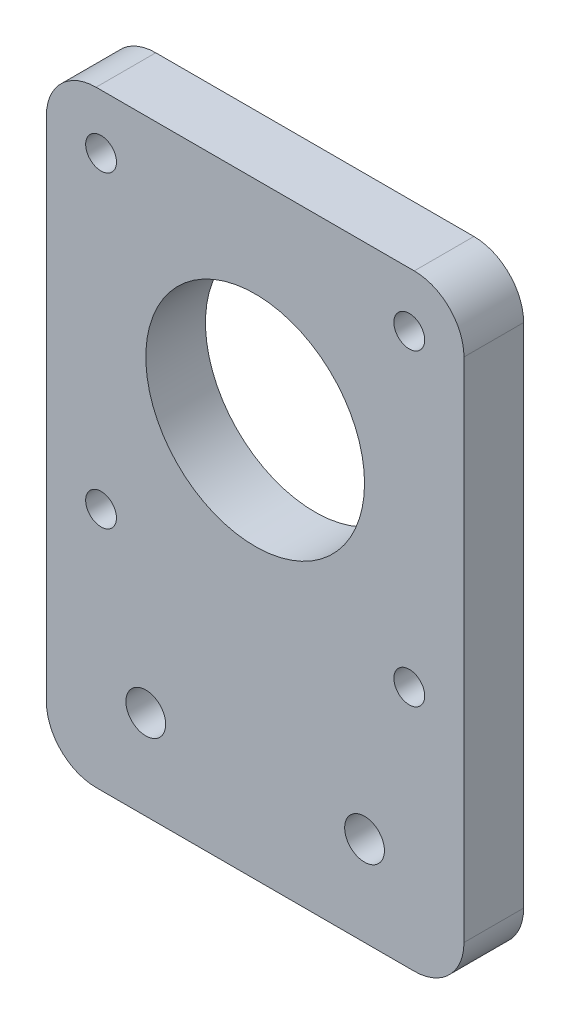
ISO-10303-21;
HEADER;
FILE_DESCRIPTION(('STEP AP214'),'2;1');
FILE_NAME('part.step','',(''),(''),'','','');
FILE_SCHEMA(('AUTOMOTIVE_DESIGN { 1 0 10303 214 1 1 1 1 }'));
ENDSEC;
DATA;
#1=APPLICATION_CONTEXT('core data for automotive mechanical design processes');
#2=APPLICATION_PROTOCOL_DEFINITION('international standard','automotive_design',2000,#1);
#3=PRODUCT_CONTEXT('',#1,'mechanical');
#4=PRODUCT('Part','Part','',(#3));
#5=PRODUCT_RELATED_PRODUCT_CATEGORY('part','',(#4));
#6=PRODUCT_DEFINITION_FORMATION('','',#4);
#7=PRODUCT_DEFINITION_CONTEXT('part definition',#1,'design');
#8=PRODUCT_DEFINITION('design','',#6,#7);
#9=PRODUCT_DEFINITION_SHAPE('','',#8);
#10=(LENGTH_UNIT() NAMED_UNIT(*) SI_UNIT(.MILLI.,.METRE.));
#11=(NAMED_UNIT(*) PLANE_ANGLE_UNIT() SI_UNIT($,.RADIAN.));
#12=(NAMED_UNIT(*) SI_UNIT($,.STERADIAN.) SOLID_ANGLE_UNIT());
#13=UNCERTAINTY_MEASURE_WITH_UNIT(LENGTH_MEASURE(1.E-05),#10,'distance_accuracy_value','');
#14=(GEOMETRIC_REPRESENTATION_CONTEXT(3) GLOBAL_UNCERTAINTY_ASSIGNED_CONTEXT((#13)) GLOBAL_UNIT_ASSIGNED_CONTEXT((#10,
#11,#12)) REPRESENTATION_CONTEXT('',''));
#15=CARTESIAN_POINT('',(0.,0.,0.));
#16=DIRECTION('',(0.,0.,1.));
#17=DIRECTION('',(1.,0.,0.));
#18=AXIS2_PLACEMENT_3D('',#15,#16,#17);
#19=CARTESIAN_POINT('',(5.,5.,6.));
#20=DIRECTION('',(0.,0.,-1.));
#21=DIRECTION('',(-1.,0.,0.));
#22=AXIS2_PLACEMENT_3D('',#19,#20,#21);
#23=PLANE('',#22);
#24=CARTESIAN_POINT('',(5.,5.,6.));
#25=DIRECTION('',(0.,0.,1.));
#26=DIRECTION('',(-1.,0.,0.));
#27=AXIS2_PLACEMENT_3D('',#24,#25,#26);
#28=CIRCLE('',#27,5.);
#29=CARTESIAN_POINT('',(0.,5.00000000000003,6.));
#30=VERTEX_POINT('',#29);
#31=CARTESIAN_POINT('',(5.00000000000003,0.,6.));
#32=VERTEX_POINT('',#31);
#33=EDGE_CURVE('E145',#30,#32,#28,.T.);
#34=ORIENTED_EDGE('',*,*,#33,.T.);
#35=DIRECTION('',(1.,0.,0.));
#36=VECTOR('',#35,1.);
#37=CARTESIAN_POINT('',(5.00000000000003,0.,6.));
#38=LINE('',#37,#36);
#39=CARTESIAN_POINT('',(37.,0.,6.));
#40=VERTEX_POINT('',#39);
#41=EDGE_CURVE('E93',#32,#40,#38,.T.);
#42=ORIENTED_EDGE('',*,*,#41,.T.);
#43=CARTESIAN_POINT('',(37.,5.,6.));
#44=DIRECTION('',(0.,0.,1.));
#45=DIRECTION('',(1.,0.,0.));
#46=AXIS2_PLACEMENT_3D('',#43,#44,#45);
#47=CIRCLE('',#46,5.);
#48=CARTESIAN_POINT('',(42.,5.,6.));
#49=VERTEX_POINT('',#48);
#50=EDGE_CURVE('E160',#40,#49,#47,.T.);
#51=ORIENTED_EDGE('',*,*,#50,.T.);
#52=DIRECTION('',(0.,1.,0.));
#53=VECTOR('',#52,1.);
#54=CARTESIAN_POINT('',(42.,5.00000000000003,6.));
#55=LINE('',#54,#53);
#56=CARTESIAN_POINT('',(42.,56.,6.));
#57=VERTEX_POINT('',#56);
#58=EDGE_CURVE('E173',#49,#57,#55,.T.);
#59=ORIENTED_EDGE('',*,*,#58,.T.);
#60=CARTESIAN_POINT('',(37.,56.,6.));
#61=DIRECTION('',(0.,0.,1.));
#62=DIRECTION('',(-1.,0.,0.));
#63=AXIS2_PLACEMENT_3D('',#60,#61,#62);
#64=CIRCLE('',#63,5.);
#65=CARTESIAN_POINT('',(37.,61.,6.));
#66=VERTEX_POINT('',#65);
#67=EDGE_CURVE('E112',#57,#66,#64,.T.);
#68=ORIENTED_EDGE('',*,*,#67,.T.);
#69=DIRECTION('',(-1.,0.,0.));
#70=VECTOR('',#69,1.);
#71=CARTESIAN_POINT('',(5.00000000000004,61.,6.));
#72=LINE('',#71,#70);
#73=CARTESIAN_POINT('',(5.00000000000004,61.,6.));
#74=VERTEX_POINT('',#73);
#75=EDGE_CURVE('E106',#66,#74,#72,.T.);
#76=ORIENTED_EDGE('',*,*,#75,.T.);
#77=CARTESIAN_POINT('',(5.,56.,6.));
#78=DIRECTION('',(0.,0.,1.));
#79=DIRECTION('',(-1.,0.,0.));
#80=AXIS2_PLACEMENT_3D('',#77,#78,#79);
#81=CIRCLE('',#80,5.);
#82=CARTESIAN_POINT('',(0.,56.,6.));
#83=VERTEX_POINT('',#82);
#84=EDGE_CURVE('E110',#74,#83,#81,.T.);
#85=ORIENTED_EDGE('',*,*,#84,.T.);
#86=DIRECTION('',(0.,-1.,0.));
#87=VECTOR('',#86,1.);
#88=CARTESIAN_POINT('',(0.,5.00000000000003,6.));
#89=LINE('',#88,#87);
#90=EDGE_CURVE('E50',#83,#30,#89,.T.);
#91=ORIENTED_EDGE('',*,*,#90,.T.);
#92=EDGE_LOOP('',(#34,#42,#51,#59,#68,#76,#85,#91));
#93=FACE_BOUND('',#92,.T.);
#94=CARTESIAN_POINT('',(21.,40.,6.));
#95=DIRECTION('',(0.,0.,1.));
#96=DIRECTION('',(1.,0.,0.));
#97=AXIS2_PLACEMENT_3D('',#94,#95,#96);
#98=CIRCLE('',#97,11.);
#99=CARTESIAN_POINT('',(32.,40.,6.));
#100=VERTEX_POINT('',#99);
#101=EDGE_CURVE('E134',#100,#100,#98,.T.);
#102=ORIENTED_EDGE('',*,*,#101,.F.);
#103=EDGE_LOOP('',(#102));
#104=FACE_BOUND('',#103,.T.);
#105=CARTESIAN_POINT('',(36.5,55.5,6.));
#106=DIRECTION('',(0.,0.,1.));
#107=DIRECTION('',(1.,0.,0.));
#108=AXIS2_PLACEMENT_3D('',#105,#106,#107);
#109=CIRCLE('',#108,1.55);
#110=CARTESIAN_POINT('',(38.05,55.5,6.));
#111=VERTEX_POINT('',#110);
#112=EDGE_CURVE('E182',#111,#111,#109,.T.);
#113=ORIENTED_EDGE('',*,*,#112,.F.);
#114=EDGE_LOOP('',(#113));
#115=FACE_BOUND('',#114,.T.);
#116=CARTESIAN_POINT('',(5.49999999999999,55.5,6.));
#117=DIRECTION('',(0.,0.,1.));
#118=DIRECTION('',(1.,0.,0.));
#119=AXIS2_PLACEMENT_3D('',#116,#117,#118);
#120=CIRCLE('',#119,1.55);
#121=CARTESIAN_POINT('',(7.05,55.5,6.));
#122=VERTEX_POINT('',#121);
#123=EDGE_CURVE('E188',#122,#122,#120,.T.);
#124=ORIENTED_EDGE('',*,*,#123,.F.);
#125=EDGE_LOOP('',(#124));
#126=FACE_BOUND('',#125,.T.);
#127=CARTESIAN_POINT('',(5.49999999999999,24.5,6.));
#128=DIRECTION('',(0.,0.,1.));
#129=DIRECTION('',(1.,0.,0.));
#130=AXIS2_PLACEMENT_3D('',#127,#128,#129);
#131=CIRCLE('',#130,1.55);
#132=CARTESIAN_POINT('',(7.04999999999999,24.5,6.));
#133=VERTEX_POINT('',#132);
#134=EDGE_CURVE('E194',#133,#133,#131,.T.);
#135=ORIENTED_EDGE('',*,*,#134,.F.);
#136=EDGE_LOOP('',(#135));
#137=FACE_BOUND('',#136,.T.);
#138=CARTESIAN_POINT('',(36.5,24.5,6.));
#139=DIRECTION('',(0.,0.,1.));
#140=DIRECTION('',(1.,0.,0.));
#141=AXIS2_PLACEMENT_3D('',#138,#139,#140);
#142=CIRCLE('',#141,1.55);
#143=CARTESIAN_POINT('',(38.05,24.5,6.));
#144=VERTEX_POINT('',#143);
#145=EDGE_CURVE('E200',#144,#144,#142,.T.);
#146=ORIENTED_EDGE('',*,*,#145,.F.);
#147=EDGE_LOOP('',(#146));
#148=FACE_BOUND('',#147,.T.);
#149=CARTESIAN_POINT('',(10.,9.,6.));
#150=DIRECTION('',(0.,0.,1.));
#151=DIRECTION('',(1.,0.,0.));
#152=AXIS2_PLACEMENT_3D('',#149,#150,#151);
#153=CIRCLE('',#152,2.);
#154=CARTESIAN_POINT('',(12.,9.,6.));
#155=VERTEX_POINT('',#154);
#156=EDGE_CURVE('E206',#155,#155,#153,.T.);
#157=ORIENTED_EDGE('',*,*,#156,.F.);
#158=EDGE_LOOP('',(#157));
#159=FACE_BOUND('',#158,.T.);
#160=CARTESIAN_POINT('',(32.,9.,6.));
#161=DIRECTION('',(0.,0.,1.));
#162=DIRECTION('',(1.,0.,0.));
#163=AXIS2_PLACEMENT_3D('',#160,#161,#162);
#164=CIRCLE('',#163,2.);
#165=CARTESIAN_POINT('',(34.,9.,6.));
#166=VERTEX_POINT('',#165);
#167=EDGE_CURVE('E212',#166,#166,#164,.T.);
#168=ORIENTED_EDGE('',*,*,#167,.F.);
#169=EDGE_LOOP('',(#168));
#170=FACE_BOUND('',#169,.T.);
#171=ADVANCED_FACE('F33',(#93,#104,#115,#126,#137,#148,#159,#170),#23,.F.);
#172=CARTESIAN_POINT('',(5.,5.,0.));
#173=DIRECTION('',(0.,0.,-1.));
#174=DIRECTION('',(-1.,0.,0.));
#175=AXIS2_PLACEMENT_3D('',#172,#173,#174);
#176=PLANE('',#175);
#177=CARTESIAN_POINT('',(10.,9.,0.));
#178=DIRECTION('',(0.,0.,1.));
#179=DIRECTION('',(1.,0.,0.));
#180=AXIS2_PLACEMENT_3D('',#177,#178,#179);
#181=CIRCLE('',#180,2.);
#182=CARTESIAN_POINT('',(12.,9.,0.));
#183=VERTEX_POINT('',#182);
#184=EDGE_CURVE('E209',#183,#183,#181,.T.);
#185=ORIENTED_EDGE('',*,*,#184,.T.);
#186=EDGE_LOOP('',(#185));
#187=FACE_BOUND('',#186,.T.);
#188=CARTESIAN_POINT('',(5.49999999999999,24.5,0.));
#189=DIRECTION('',(0.,0.,1.));
#190=DIRECTION('',(1.,0.,0.));
#191=AXIS2_PLACEMENT_3D('',#188,#189,#190);
#192=CIRCLE('',#191,1.55);
#193=CARTESIAN_POINT('',(7.04999999999999,24.5,0.));
#194=VERTEX_POINT('',#193);
#195=EDGE_CURVE('E197',#194,#194,#192,.T.);
#196=ORIENTED_EDGE('',*,*,#195,.T.);
#197=EDGE_LOOP('',(#196));
#198=FACE_BOUND('',#197,.T.);
#199=CARTESIAN_POINT('',(36.5,55.5,0.));
#200=DIRECTION('',(0.,0.,1.));
#201=DIRECTION('',(1.,0.,0.));
#202=AXIS2_PLACEMENT_3D('',#199,#200,#201);
#203=CIRCLE('',#202,1.55);
#204=CARTESIAN_POINT('',(38.05,55.5,0.));
#205=VERTEX_POINT('',#204);
#206=EDGE_CURVE('E185',#205,#205,#203,.T.);
#207=ORIENTED_EDGE('',*,*,#206,.T.);
#208=EDGE_LOOP('',(#207));
#209=FACE_BOUND('',#208,.T.);
#210=CARTESIAN_POINT('',(5.,5.,0.));
#211=DIRECTION('',(0.,0.,1.));
#212=DIRECTION('',(-1.,0.,0.));
#213=AXIS2_PLACEMENT_3D('',#210,#211,#212);
#214=CIRCLE('',#213,5.);
#215=CARTESIAN_POINT('',(0.,5.00000000000003,0.));
#216=VERTEX_POINT('',#215);
#217=CARTESIAN_POINT('',(5.00000000000003,0.,0.));
#218=VERTEX_POINT('',#217);
#219=EDGE_CURVE('E130',#216,#218,#214,.T.);
#220=ORIENTED_EDGE('',*,*,#219,.F.);
#221=DIRECTION('',(0.,-1.,0.));
#222=VECTOR('',#221,1.);
#223=CARTESIAN_POINT('',(0.,5.00000000000003,0.));
#224=LINE('',#223,#222);
#225=CARTESIAN_POINT('',(0.,56.,0.));
#226=VERTEX_POINT('',#225);
#227=EDGE_CURVE('E85',#226,#216,#224,.T.);
#228=ORIENTED_EDGE('',*,*,#227,.F.);
#229=CARTESIAN_POINT('',(5.,56.,0.));
#230=DIRECTION('',(0.,0.,1.));
#231=DIRECTION('',(-1.,0.,0.));
#232=AXIS2_PLACEMENT_3D('',#229,#230,#231);
#233=CIRCLE('',#232,5.);
#234=CARTESIAN_POINT('',(5.00000000000004,61.,0.));
#235=VERTEX_POINT('',#234);
#236=EDGE_CURVE('E79',#235,#226,#233,.T.);
#237=ORIENTED_EDGE('',*,*,#236,.F.);
#238=DIRECTION('',(-1.,0.,0.));
#239=VECTOR('',#238,1.);
#240=CARTESIAN_POINT('',(5.00000000000004,61.,0.));
#241=LINE('',#240,#239);
#242=CARTESIAN_POINT('',(37.,61.,0.));
#243=VERTEX_POINT('',#242);
#244=EDGE_CURVE('E120',#243,#235,#241,.T.);
#245=ORIENTED_EDGE('',*,*,#244,.F.);
#246=CARTESIAN_POINT('',(37.,56.,0.));
#247=DIRECTION('',(0.,0.,1.));
#248=DIRECTION('',(-1.,0.,0.));
#249=AXIS2_PLACEMENT_3D('',#246,#247,#248);
#250=CIRCLE('',#249,5.);
#251=CARTESIAN_POINT('',(42.,56.,0.));
#252=VERTEX_POINT('',#251);
#253=EDGE_CURVE('E140',#252,#243,#250,.T.);
#254=ORIENTED_EDGE('',*,*,#253,.F.);
#255=DIRECTION('',(0.,1.,0.));
#256=VECTOR('',#255,1.);
#257=CARTESIAN_POINT('',(42.,5.00000000000003,0.));
#258=LINE('',#257,#256);
#259=CARTESIAN_POINT('',(42.,5.,0.));
#260=VERTEX_POINT('',#259);
#261=EDGE_CURVE('E138',#260,#252,#258,.T.);
#262=ORIENTED_EDGE('',*,*,#261,.F.);
#263=CARTESIAN_POINT('',(37.,5.,0.));
#264=DIRECTION('',(0.,0.,1.));
#265=DIRECTION('',(1.,0.,0.));
#266=AXIS2_PLACEMENT_3D('',#263,#264,#265);
#267=CIRCLE('',#266,5.);
#268=CARTESIAN_POINT('',(37.,0.,0.));
#269=VERTEX_POINT('',#268);
#270=EDGE_CURVE('E136',#269,#260,#267,.T.);
#271=ORIENTED_EDGE('',*,*,#270,.F.);
#272=DIRECTION('',(1.,0.,0.));
#273=VECTOR('',#272,1.);
#274=CARTESIAN_POINT('',(5.00000000000003,0.,0.));
#275=LINE('',#274,#273);
#276=EDGE_CURVE('E133',#218,#269,#275,.T.);
#277=ORIENTED_EDGE('',*,*,#276,.F.);
#278=EDGE_LOOP('',(#220,#228,#237,#245,#254,#262,#271,#277));
#279=FACE_BOUND('',#278,.T.);
#280=CARTESIAN_POINT('',(21.,40.,0.));
#281=DIRECTION('',(0.,0.,1.));
#282=DIRECTION('',(1.,0.,0.));
#283=AXIS2_PLACEMENT_3D('',#280,#281,#282);
#284=CIRCLE('',#283,11.);
#285=CARTESIAN_POINT('',(32.,40.,0.));
#286=VERTEX_POINT('',#285);
#287=EDGE_CURVE('E179',#286,#286,#284,.T.);
#288=ORIENTED_EDGE('',*,*,#287,.T.);
#289=EDGE_LOOP('',(#288));
#290=FACE_BOUND('',#289,.T.);
#291=CARTESIAN_POINT('',(5.49999999999999,55.5,0.));
#292=DIRECTION('',(0.,0.,1.));
#293=DIRECTION('',(1.,0.,0.));
#294=AXIS2_PLACEMENT_3D('',#291,#292,#293);
#295=CIRCLE('',#294,1.55);
#296=CARTESIAN_POINT('',(7.05,55.5,0.));
#297=VERTEX_POINT('',#296);
#298=EDGE_CURVE('E191',#297,#297,#295,.T.);
#299=ORIENTED_EDGE('',*,*,#298,.T.);
#300=EDGE_LOOP('',(#299));
#301=FACE_BOUND('',#300,.T.);
#302=CARTESIAN_POINT('',(36.5,24.5,0.));
#303=DIRECTION('',(0.,0.,1.));
#304=DIRECTION('',(1.,0.,0.));
#305=AXIS2_PLACEMENT_3D('',#302,#303,#304);
#306=CIRCLE('',#305,1.55);
#307=CARTESIAN_POINT('',(38.05,24.5,0.));
#308=VERTEX_POINT('',#307);
#309=EDGE_CURVE('E203',#308,#308,#306,.T.);
#310=ORIENTED_EDGE('',*,*,#309,.T.);
#311=EDGE_LOOP('',(#310));
#312=FACE_BOUND('',#311,.T.);
#313=CARTESIAN_POINT('',(32.,9.,0.));
#314=DIRECTION('',(0.,0.,1.));
#315=DIRECTION('',(1.,0.,0.));
#316=AXIS2_PLACEMENT_3D('',#313,#314,#315);
#317=CIRCLE('',#316,2.);
#318=CARTESIAN_POINT('',(34.,9.,0.));
#319=VERTEX_POINT('',#318);
#320=EDGE_CURVE('E215',#319,#319,#317,.T.);
#321=ORIENTED_EDGE('',*,*,#320,.T.);
#322=EDGE_LOOP('',(#321));
#323=FACE_BOUND('',#322,.T.);
#324=ADVANCED_FACE('F164',(#187,#198,#209,#279,#290,#301,#312,#323),#176,.T.);
#325=CARTESIAN_POINT('',(5.,5.,6.));
#326=DIRECTION('',(0.,0.,-1.));
#327=DIRECTION('',(-1.,0.,0.));
#328=AXIS2_PLACEMENT_3D('',#325,#326,#327);
#329=CYLINDRICAL_SURFACE('',#328,5.);
#330=ORIENTED_EDGE('',*,*,#219,.T.);
#331=DIRECTION('',(0.,0.,-1.));
#332=VECTOR('',#331,1.);
#333=CARTESIAN_POINT('',(5.00000000000003,0.,6.));
#334=LINE('',#333,#332);
#335=EDGE_CURVE('E11',#32,#218,#334,.T.);
#336=ORIENTED_EDGE('',*,*,#335,.F.);
#337=ORIENTED_EDGE('',*,*,#33,.F.);
#338=DIRECTION('',(0.,0.,-1.));
#339=VECTOR('',#338,1.);
#340=CARTESIAN_POINT('',(0.,5.00000000000003,6.));
#341=LINE('',#340,#339);
#342=EDGE_CURVE('E126',#30,#216,#341,.T.);
#343=ORIENTED_EDGE('',*,*,#342,.T.);
#344=EDGE_LOOP('',(#330,#336,#337,#343));
#345=FACE_BOUND('',#344,.T.);
#346=ADVANCED_FACE('F35',(#345),#329,.T.);
#347=CARTESIAN_POINT('',(5.00000000000003,0.,6.));
#348=DIRECTION('',(0.,1.,0.));
#349=DIRECTION('',(0.,0.,1.));
#350=AXIS2_PLACEMENT_3D('',#347,#348,#349);
#351=PLANE('',#350);
#352=ORIENTED_EDGE('',*,*,#276,.T.);
#353=DIRECTION('',(0.,0.,-1.));
#354=VECTOR('',#353,1.);
#355=CARTESIAN_POINT('',(37.,0.,6.));
#356=LINE('',#355,#354);
#357=EDGE_CURVE('E42',#40,#269,#356,.T.);
#358=ORIENTED_EDGE('',*,*,#357,.F.);
#359=ORIENTED_EDGE('',*,*,#41,.F.);
#360=ORIENTED_EDGE('',*,*,#335,.T.);
#361=EDGE_LOOP('',(#352,#358,#359,#360));
#362=FACE_BOUND('',#361,.T.);
#363=ADVANCED_FACE('F247',(#362),#351,.F.);
#364=CARTESIAN_POINT('',(37.,5.,6.));
#365=DIRECTION('',(0.,0.,-1.));
#366=DIRECTION('',(-1.,0.,0.));
#367=AXIS2_PLACEMENT_3D('',#364,#365,#366);
#368=CYLINDRICAL_SURFACE('',#367,5.);
#369=ORIENTED_EDGE('',*,*,#270,.T.);
#370=DIRECTION('',(0.,0.,-1.));
#371=VECTOR('',#370,1.);
#372=CARTESIAN_POINT('',(42.,5.,6.));
#373=LINE('',#372,#371);
#374=EDGE_CURVE('E152',#49,#260,#373,.T.);
#375=ORIENTED_EDGE('',*,*,#374,.F.);
#376=ORIENTED_EDGE('',*,*,#50,.F.);
#377=ORIENTED_EDGE('',*,*,#357,.T.);
#378=EDGE_LOOP('',(#369,#375,#376,#377));
#379=FACE_BOUND('',#378,.T.);
#380=ADVANCED_FACE('F158',(#379),#368,.T.);
#381=CARTESIAN_POINT('',(42.,5.00000000000003,6.));
#382=DIRECTION('',(-1.,0.,0.));
#383=DIRECTION('',(0.,0.,1.));
#384=AXIS2_PLACEMENT_3D('',#381,#382,#383);
#385=PLANE('',#384);
#386=ORIENTED_EDGE('',*,*,#261,.T.);
#387=DIRECTION('',(0.,0.,-1.));
#388=VECTOR('',#387,1.);
#389=CARTESIAN_POINT('',(42.,56.,6.));
#390=LINE('',#389,#388);
#391=EDGE_CURVE('E149',#57,#252,#390,.T.);
#392=ORIENTED_EDGE('',*,*,#391,.F.);
#393=ORIENTED_EDGE('',*,*,#58,.F.);
#394=ORIENTED_EDGE('',*,*,#374,.T.);
#395=EDGE_LOOP('',(#386,#392,#393,#394));
#396=FACE_BOUND('',#395,.T.);
#397=ADVANCED_FACE('F169',(#396),#385,.F.);
#398=CARTESIAN_POINT('',(37.,56.,6.));
#399=DIRECTION('',(0.,0.,-1.));
#400=DIRECTION('',(-1.,0.,0.));
#401=AXIS2_PLACEMENT_3D('',#398,#399,#400);
#402=CYLINDRICAL_SURFACE('',#401,5.);
#403=ORIENTED_EDGE('',*,*,#253,.T.);
#404=DIRECTION('',(0.,0.,-1.));
#405=VECTOR('',#404,1.);
#406=CARTESIAN_POINT('',(37.,61.,6.));
#407=LINE('',#406,#405);
#408=EDGE_CURVE('E121',#66,#243,#407,.T.);
#409=ORIENTED_EDGE('',*,*,#408,.F.);
#410=ORIENTED_EDGE('',*,*,#67,.F.);
#411=ORIENTED_EDGE('',*,*,#391,.T.);
#412=EDGE_LOOP('',(#403,#409,#410,#411));
#413=FACE_BOUND('',#412,.T.);
#414=ADVANCED_FACE('F172',(#413),#402,.T.);
#415=CARTESIAN_POINT('',(5.00000000000004,61.,6.));
#416=DIRECTION('',(0.,-1.,0.));
#417=DIRECTION('',(0.,0.,-1.));
#418=AXIS2_PLACEMENT_3D('',#415,#416,#417);
#419=PLANE('',#418);
#420=ORIENTED_EDGE('',*,*,#244,.T.);
#421=DIRECTION('',(0.,0.,-1.));
#422=VECTOR('',#421,1.);
#423=CARTESIAN_POINT('',(5.00000000000004,61.,6.));
#424=LINE('',#423,#422);
#425=EDGE_CURVE('E117',#74,#235,#424,.T.);
#426=ORIENTED_EDGE('',*,*,#425,.F.);
#427=ORIENTED_EDGE('',*,*,#75,.F.);
#428=ORIENTED_EDGE('',*,*,#408,.T.);
#429=EDGE_LOOP('',(#420,#426,#427,#428));
#430=FACE_BOUND('',#429,.T.);
#431=ADVANCED_FACE('F118',(#430),#419,.F.);
#432=CARTESIAN_POINT('',(5.,56.,6.));
#433=DIRECTION('',(0.,0.,-1.));
#434=DIRECTION('',(-1.,0.,0.));
#435=AXIS2_PLACEMENT_3D('',#432,#433,#434);
#436=CYLINDRICAL_SURFACE('',#435,5.);
#437=ORIENTED_EDGE('',*,*,#236,.T.);
#438=DIRECTION('',(0.,0.,-1.));
#439=VECTOR('',#438,1.);
#440=CARTESIAN_POINT('',(0.,56.,6.));
#441=LINE('',#440,#439);
#442=EDGE_CURVE('E122',#83,#226,#441,.T.);
#443=ORIENTED_EDGE('',*,*,#442,.F.);
#444=ORIENTED_EDGE('',*,*,#84,.F.);
#445=ORIENTED_EDGE('',*,*,#425,.T.);
#446=EDGE_LOOP('',(#437,#443,#444,#445));
#447=FACE_BOUND('',#446,.T.);
#448=ADVANCED_FACE('F124',(#447),#436,.T.);
#449=CARTESIAN_POINT('',(0.,5.00000000000003,6.));
#450=DIRECTION('',(1.,0.,0.));
#451=DIRECTION('',(0.,0.,-1.));
#452=AXIS2_PLACEMENT_3D('',#449,#450,#451);
#453=PLANE('',#452);
#454=ORIENTED_EDGE('',*,*,#227,.T.);
#455=ORIENTED_EDGE('',*,*,#342,.F.);
#456=ORIENTED_EDGE('',*,*,#90,.F.);
#457=ORIENTED_EDGE('',*,*,#442,.T.);
#458=EDGE_LOOP('',(#454,#455,#456,#457));
#459=FACE_BOUND('',#458,.T.);
#460=ADVANCED_FACE('F235',(#459),#453,.F.);
#461=CARTESIAN_POINT('',(21.,40.,6.));
#462=DIRECTION('',(0.,0.,-1.));
#463=DIRECTION('',(-1.,0.,0.));
#464=AXIS2_PLACEMENT_3D('',#461,#462,#463);
#465=CYLINDRICAL_SURFACE('',#464,11.);
#466=ORIENTED_EDGE('',*,*,#101,.T.);
#467=EDGE_LOOP('',(#466));
#468=FACE_BOUND('',#467,.T.);
#469=ORIENTED_EDGE('',*,*,#287,.F.);
#470=EDGE_LOOP('',(#469));
#471=FACE_BOUND('',#470,.T.);
#472=ADVANCED_FACE('F232',(#468,#471),#465,.F.);
#473=CARTESIAN_POINT('',(36.5,55.5,6.));
#474=DIRECTION('',(0.,0.,-1.));
#475=DIRECTION('',(-1.,0.,0.));
#476=AXIS2_PLACEMENT_3D('',#473,#474,#475);
#477=CYLINDRICAL_SURFACE('',#476,1.55);
#478=ORIENTED_EDGE('',*,*,#112,.T.);
#479=EDGE_LOOP('',(#478));
#480=FACE_BOUND('',#479,.T.);
#481=ORIENTED_EDGE('',*,*,#206,.F.);
#482=EDGE_LOOP('',(#481));
#483=FACE_BOUND('',#482,.T.);
#484=ADVANCED_FACE('F311',(#480,#483),#477,.F.);
#485=CARTESIAN_POINT('',(5.49999999999999,55.5,6.));
#486=DIRECTION('',(0.,0.,-1.));
#487=DIRECTION('',(-1.,0.,0.));
#488=AXIS2_PLACEMENT_3D('',#485,#486,#487);
#489=CYLINDRICAL_SURFACE('',#488,1.55);
#490=ORIENTED_EDGE('',*,*,#123,.T.);
#491=EDGE_LOOP('',(#490));
#492=FACE_BOUND('',#491,.T.);
#493=ORIENTED_EDGE('',*,*,#298,.F.);
#494=EDGE_LOOP('',(#493));
#495=FACE_BOUND('',#494,.T.);
#496=ADVANCED_FACE('F319',(#492,#495),#489,.F.);
#497=CARTESIAN_POINT('',(5.49999999999999,24.5,6.));
#498=DIRECTION('',(0.,0.,-1.));
#499=DIRECTION('',(-1.,0.,0.));
#500=AXIS2_PLACEMENT_3D('',#497,#498,#499);
#501=CYLINDRICAL_SURFACE('',#500,1.55);
#502=ORIENTED_EDGE('',*,*,#134,.T.);
#503=EDGE_LOOP('',(#502));
#504=FACE_BOUND('',#503,.T.);
#505=ORIENTED_EDGE('',*,*,#195,.F.);
#506=EDGE_LOOP('',(#505));
#507=FACE_BOUND('',#506,.T.);
#508=ADVANCED_FACE('F327',(#504,#507),#501,.F.);
#509=CARTESIAN_POINT('',(36.5,24.5,6.));
#510=DIRECTION('',(0.,0.,-1.));
#511=DIRECTION('',(-1.,0.,0.));
#512=AXIS2_PLACEMENT_3D('',#509,#510,#511);
#513=CYLINDRICAL_SURFACE('',#512,1.55);
#514=ORIENTED_EDGE('',*,*,#145,.T.);
#515=EDGE_LOOP('',(#514));
#516=FACE_BOUND('',#515,.T.);
#517=ORIENTED_EDGE('',*,*,#309,.F.);
#518=EDGE_LOOP('',(#517));
#519=FACE_BOUND('',#518,.T.);
#520=ADVANCED_FACE('F336',(#516,#519),#513,.F.);
#521=CARTESIAN_POINT('',(10.,9.,6.));
#522=DIRECTION('',(0.,0.,-1.));
#523=DIRECTION('',(-1.,0.,0.));
#524=AXIS2_PLACEMENT_3D('',#521,#522,#523);
#525=CYLINDRICAL_SURFACE('',#524,2.);
#526=ORIENTED_EDGE('',*,*,#156,.T.);
#527=EDGE_LOOP('',(#526));
#528=FACE_BOUND('',#527,.T.);
#529=ORIENTED_EDGE('',*,*,#184,.F.);
#530=EDGE_LOOP('',(#529));
#531=FACE_BOUND('',#530,.T.);
#532=ADVANCED_FACE('F345',(#528,#531),#525,.F.);
#533=CARTESIAN_POINT('',(32.,9.,6.));
#534=DIRECTION('',(0.,0.,-1.));
#535=DIRECTION('',(-1.,0.,0.));
#536=AXIS2_PLACEMENT_3D('',#533,#534,#535);
#537=CYLINDRICAL_SURFACE('',#536,2.);
#538=ORIENTED_EDGE('',*,*,#167,.T.);
#539=EDGE_LOOP('',(#538));
#540=FACE_BOUND('',#539,.T.);
#541=ORIENTED_EDGE('',*,*,#320,.F.);
#542=EDGE_LOOP('',(#541));
#543=FACE_BOUND('',#542,.T.);
#544=ADVANCED_FACE('F221',(#540,#543),#537,.F.);
#545=CLOSED_SHELL('',(#171,#324,#346,#363,#380,#397,#414,#431,#448,#460,#472,#484,#496,#508,
#520,#532,#544));
#546=MANIFOLD_SOLID_BREP('B2',#545);
#547=ADVANCED_BREP_SHAPE_REPRESENTATION('',(#18,#546),#14);
#548=SHAPE_DEFINITION_REPRESENTATION(#9,#547);
ENDSEC;
END-ISO-10303-21;
